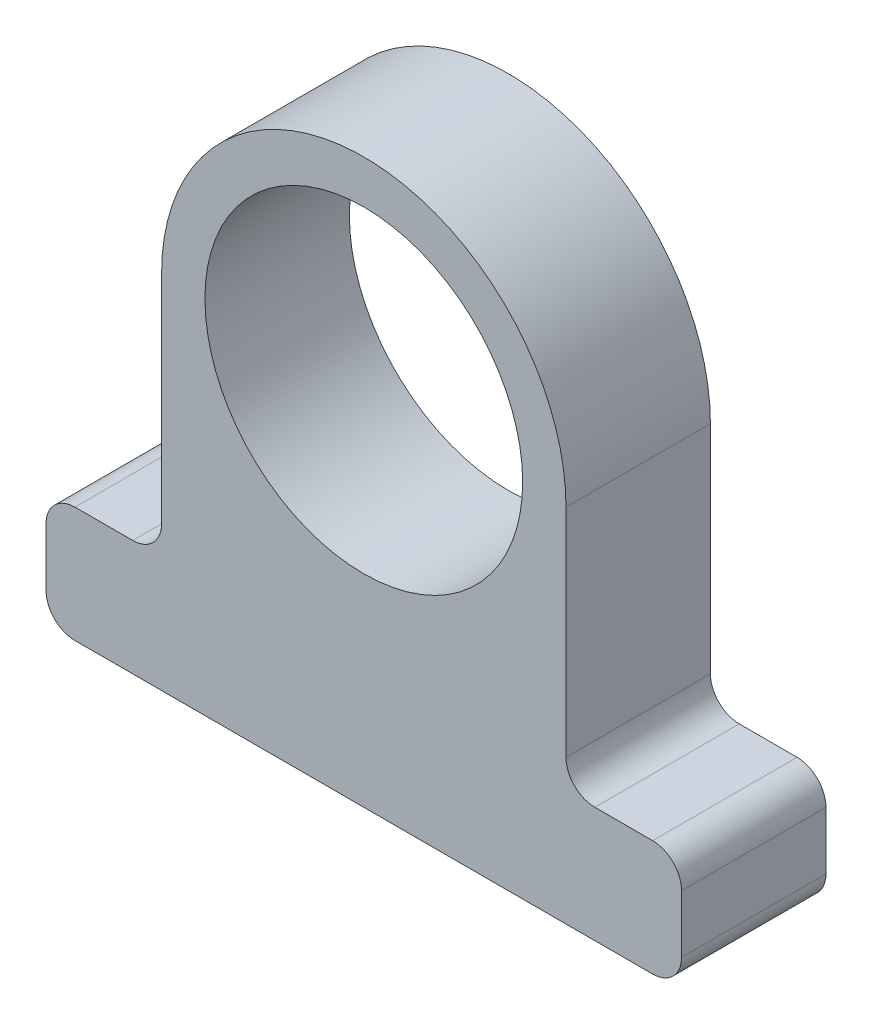
ISO-10303-21;
HEADER;
FILE_DESCRIPTION(('STEP AP214'),'2;1');
FILE_NAME('part.step','',(''),(''),'','','');
FILE_SCHEMA(('AUTOMOTIVE_DESIGN { 1 0 10303 214 1 1 1 1 }'));
ENDSEC;
DATA;
#1=APPLICATION_CONTEXT('core data for automotive mechanical design processes');
#2=APPLICATION_PROTOCOL_DEFINITION('international standard','automotive_design',2000,#1);
#3=PRODUCT_CONTEXT('',#1,'mechanical');
#4=PRODUCT('Part','Part','',(#3));
#5=PRODUCT_RELATED_PRODUCT_CATEGORY('part','',(#4));
#6=PRODUCT_DEFINITION_FORMATION('','',#4);
#7=PRODUCT_DEFINITION_CONTEXT('part definition',#1,'design');
#8=PRODUCT_DEFINITION('design','',#6,#7);
#9=PRODUCT_DEFINITION_SHAPE('','',#8);
#10=(LENGTH_UNIT() NAMED_UNIT(*) SI_UNIT(.MILLI.,.METRE.));
#11=(NAMED_UNIT(*) PLANE_ANGLE_UNIT() SI_UNIT($,.RADIAN.));
#12=(NAMED_UNIT(*) SI_UNIT($,.STERADIAN.) SOLID_ANGLE_UNIT());
#13=UNCERTAINTY_MEASURE_WITH_UNIT(LENGTH_MEASURE(1.E-05),#10,'distance_accuracy_value','');
#14=(GEOMETRIC_REPRESENTATION_CONTEXT(3) GLOBAL_UNCERTAINTY_ASSIGNED_CONTEXT((#13)) GLOBAL_UNIT_ASSIGNED_CONTEXT((#10,
#11,#12)) REPRESENTATION_CONTEXT('',''));
#15=CARTESIAN_POINT('',(0.,0.,0.));
#16=DIRECTION('',(0.,0.,1.));
#17=DIRECTION('',(1.,0.,0.));
#18=AXIS2_PLACEMENT_3D('',#15,#16,#17);
#19=CARTESIAN_POINT('',(14.,0.,10.));
#20=DIRECTION('',(-1.,0.,0.));
#21=DIRECTION('',(0.,-1.,0.));
#22=AXIS2_PLACEMENT_3D('',#19,#20,#21);
#23=PLANE('',#22);
#24=DIRECTION('',(0.,1.,0.));
#25=VECTOR('',#24,1.);
#26=CARTESIAN_POINT('',(14.,0.,10.));
#27=LINE('',#26,#25);
#28=CARTESIAN_POINT('',(14.,-15.,10.));
#29=VERTEX_POINT('',#28);
#30=CARTESIAN_POINT('',(14.,0.,10.));
#31=VERTEX_POINT('',#30);
#32=EDGE_CURVE('E146',#29,#31,#27,.T.);
#33=ORIENTED_EDGE('',*,*,#32,.F.);
#34=DIRECTION('',(0.,0.,-1.));
#35=VECTOR('',#34,1.);
#36=CARTESIAN_POINT('',(14.,-15.,0.));
#37=LINE('',#36,#35);
#38=CARTESIAN_POINT('',(14.,-15.,0.));
#39=VERTEX_POINT('',#38);
#40=EDGE_CURVE('E242',#29,#39,#37,.T.);
#41=ORIENTED_EDGE('',*,*,#40,.T.);
#42=DIRECTION('',(0.,1.,0.));
#43=VECTOR('',#42,1.);
#44=CARTESIAN_POINT('',(14.,0.,0.));
#45=LINE('',#44,#43);
#46=CARTESIAN_POINT('',(14.,0.,0.));
#47=VERTEX_POINT('',#46);
#48=EDGE_CURVE('E173',#39,#47,#45,.T.);
#49=ORIENTED_EDGE('',*,*,#48,.T.);
#50=DIRECTION('',(0.,0.,-1.));
#51=VECTOR('',#50,1.);
#52=CARTESIAN_POINT('',(14.,0.,10.));
#53=LINE('',#52,#51);
#54=EDGE_CURVE('E165',#31,#47,#53,.T.);
#55=ORIENTED_EDGE('',*,*,#54,.F.);
#56=EDGE_LOOP('',(#33,#41,#49,#55));
#57=FACE_BOUND('',#56,.T.);
#58=ADVANCED_FACE('F45',(#57),#23,.F.);
#59=CARTESIAN_POINT('',(0.,0.,10.));
#60=DIRECTION('',(0.,0.,-1.));
#61=DIRECTION('',(-1.,0.,0.));
#62=AXIS2_PLACEMENT_3D('',#59,#60,#61);
#63=CYLINDRICAL_SURFACE('',#62,14.);
#64=CARTESIAN_POINT('',(0.,0.,0.));
#65=DIRECTION('',(0.,0.,1.));
#66=DIRECTION('',(1.,0.,0.));
#67=AXIS2_PLACEMENT_3D('',#64,#65,#66);
#68=CIRCLE('',#67,14.);
#69=CARTESIAN_POINT('',(-14.,0.,0.));
#70=VERTEX_POINT('',#69);
#71=EDGE_CURVE('E323',#47,#70,#68,.T.);
#72=ORIENTED_EDGE('',*,*,#71,.T.);
#73=DIRECTION('',(0.,0.,-1.));
#74=VECTOR('',#73,1.);
#75=CARTESIAN_POINT('',(-14.,0.,10.));
#76=LINE('',#75,#74);
#77=CARTESIAN_POINT('',(-14.,0.,10.));
#78=VERTEX_POINT('',#77);
#79=EDGE_CURVE('E167',#78,#70,#76,.T.);
#80=ORIENTED_EDGE('',*,*,#79,.F.);
#81=CARTESIAN_POINT('',(0.,0.,10.));
#82=DIRECTION('',(0.,0.,1.));
#83=DIRECTION('',(1.,0.,0.));
#84=AXIS2_PLACEMENT_3D('',#81,#82,#83);
#85=CIRCLE('',#84,14.);
#86=EDGE_CURVE('E152',#31,#78,#85,.T.);
#87=ORIENTED_EDGE('',*,*,#86,.F.);
#88=ORIENTED_EDGE('',*,*,#54,.T.);
#89=EDGE_LOOP('',(#72,#80,#87,#88));
#90=FACE_BOUND('',#89,.T.);
#91=ADVANCED_FACE('F164',(#90),#63,.T.);
#92=CARTESIAN_POINT('',(-14.,0.,10.));
#93=DIRECTION('',(1.,0.,0.));
#94=DIRECTION('',(0.,1.,0.));
#95=AXIS2_PLACEMENT_3D('',#92,#93,#94);
#96=PLANE('',#95);
#97=DIRECTION('',(0.,-1.,0.));
#98=VECTOR('',#97,1.);
#99=CARTESIAN_POINT('',(-14.,0.,0.));
#100=LINE('',#99,#98);
#101=CARTESIAN_POINT('',(-14.,-15.,0.));
#102=VERTEX_POINT('',#101);
#103=EDGE_CURVE('E326',#70,#102,#100,.T.);
#104=ORIENTED_EDGE('',*,*,#103,.T.);
#105=DIRECTION('',(0.,0.,-1.));
#106=VECTOR('',#105,1.);
#107=CARTESIAN_POINT('',(-14.,-15.,10.));
#108=LINE('',#107,#106);
#109=CARTESIAN_POINT('',(-14.,-15.,10.));
#110=VERTEX_POINT('',#109);
#111=EDGE_CURVE('E226',#102,#110,#108,.F.);
#112=ORIENTED_EDGE('',*,*,#111,.T.);
#113=DIRECTION('',(0.,-1.,0.));
#114=VECTOR('',#113,1.);
#115=CARTESIAN_POINT('',(-14.,0.,10.));
#116=LINE('',#115,#114);
#117=EDGE_CURVE('E170',#78,#110,#116,.T.);
#118=ORIENTED_EDGE('',*,*,#117,.F.);
#119=ORIENTED_EDGE('',*,*,#79,.T.);
#120=EDGE_LOOP('',(#104,#112,#118,#119));
#121=FACE_BOUND('',#120,.T.);
#122=ADVANCED_FACE('F275',(#121),#96,.F.);
#123=CARTESIAN_POINT('',(0.,-17.,10.));
#124=DIRECTION('',(0.,-1.,0.));
#125=DIRECTION('',(0.,0.,-1.));
#126=AXIS2_PLACEMENT_3D('',#123,#124,#125);
#127=PLANE('',#126);
#128=DIRECTION('',(-1.,0.,0.));
#129=VECTOR('',#128,1.);
#130=CARTESIAN_POINT('',(0.,-17.,10.));
#131=LINE('',#130,#129);
#132=CARTESIAN_POINT('',(-16.,-17.,10.));
#133=VERTEX_POINT('',#132);
#134=CARTESIAN_POINT('',(-20.,-17.,10.));
#135=VERTEX_POINT('',#134);
#136=EDGE_CURVE('E382',#133,#135,#131,.T.);
#137=ORIENTED_EDGE('',*,*,#136,.F.);
#138=DIRECTION('',(0.,0.,-1.));
#139=VECTOR('',#138,1.);
#140=CARTESIAN_POINT('',(-16.,-17.,0.));
#141=LINE('',#140,#139);
#142=CARTESIAN_POINT('',(-16.,-17.,0.));
#143=VERTEX_POINT('',#142);
#144=EDGE_CURVE('E222',#133,#143,#141,.T.);
#145=ORIENTED_EDGE('',*,*,#144,.T.);
#146=DIRECTION('',(-1.,0.,0.));
#147=VECTOR('',#146,1.);
#148=CARTESIAN_POINT('',(0.,-17.,0.));
#149=LINE('',#148,#147);
#150=CARTESIAN_POINT('',(-20.,-17.,0.));
#151=VERTEX_POINT('',#150);
#152=EDGE_CURVE('E330',#143,#151,#149,.T.);
#153=ORIENTED_EDGE('',*,*,#152,.T.);
#154=DIRECTION('',(0.,0.,-1.));
#155=VECTOR('',#154,1.);
#156=CARTESIAN_POINT('',(-20.,-17.,10.));
#157=LINE('',#156,#155);
#158=EDGE_CURVE('E219',#151,#135,#157,.F.);
#159=ORIENTED_EDGE('',*,*,#158,.T.);
#160=EDGE_LOOP('',(#137,#145,#153,#159));
#161=FACE_BOUND('',#160,.T.);
#162=ADVANCED_FACE('F368',(#161),#127,.F.);
#163=CARTESIAN_POINT('',(-22.,0.,10.));
#164=DIRECTION('',(1.,0.,0.));
#165=DIRECTION('',(0.,0.,-1.));
#166=AXIS2_PLACEMENT_3D('',#163,#164,#165);
#167=PLANE('',#166);
#168=DIRECTION('',(0.,-1.,0.));
#169=VECTOR('',#168,1.);
#170=CARTESIAN_POINT('',(-22.,0.,0.));
#171=LINE('',#170,#169);
#172=CARTESIAN_POINT('',(-22.,-19.,0.));
#173=VERTEX_POINT('',#172);
#174=CARTESIAN_POINT('',(-22.,-23.,0.));
#175=VERTEX_POINT('',#174);
#176=EDGE_CURVE('E334',#173,#175,#171,.T.);
#177=ORIENTED_EDGE('',*,*,#176,.T.);
#178=DIRECTION('',(0.,0.,-1.));
#179=VECTOR('',#178,1.);
#180=CARTESIAN_POINT('',(-22.,-23.,10.));
#181=LINE('',#180,#179);
#182=CARTESIAN_POINT('',(-22.,-23.,10.));
#183=VERTEX_POINT('',#182);
#184=EDGE_CURVE('E205',#175,#183,#181,.F.);
#185=ORIENTED_EDGE('',*,*,#184,.T.);
#186=DIRECTION('',(0.,-1.,0.));
#187=VECTOR('',#186,1.);
#188=CARTESIAN_POINT('',(-22.,0.,10.));
#189=LINE('',#188,#187);
#190=CARTESIAN_POINT('',(-22.,-19.,10.));
#191=VERTEX_POINT('',#190);
#192=EDGE_CURVE('E314',#191,#183,#189,.T.);
#193=ORIENTED_EDGE('',*,*,#192,.F.);
#194=DIRECTION('',(0.,0.,-1.));
#195=VECTOR('',#194,1.);
#196=CARTESIAN_POINT('',(-22.,-19.,10.));
#197=LINE('',#196,#195);
#198=EDGE_CURVE('E201',#191,#173,#197,.T.);
#199=ORIENTED_EDGE('',*,*,#198,.T.);
#200=EDGE_LOOP('',(#177,#185,#193,#199));
#201=FACE_BOUND('',#200,.T.);
#202=ADVANCED_FACE('F364',(#201),#167,.F.);
#203=CARTESIAN_POINT('',(0.,-25.,10.));
#204=DIRECTION('',(0.,1.,0.));
#205=DIRECTION('',(0.,0.,1.));
#206=AXIS2_PLACEMENT_3D('',#203,#204,#205);
#207=PLANE('',#206);
#208=DIRECTION('',(1.,0.,0.));
#209=VECTOR('',#208,1.);
#210=CARTESIAN_POINT('',(0.,-25.,10.));
#211=LINE('',#210,#209);
#212=CARTESIAN_POINT('',(-20.,-25.,10.));
#213=VERTEX_POINT('',#212);
#214=CARTESIAN_POINT('',(20.,-25.,10.));
#215=VERTEX_POINT('',#214);
#216=EDGE_CURVE('E302',#213,#215,#211,.T.);
#217=ORIENTED_EDGE('',*,*,#216,.F.);
#218=DIRECTION('',(0.,0.,-1.));
#219=VECTOR('',#218,1.);
#220=CARTESIAN_POINT('',(-20.,-25.,10.));
#221=LINE('',#220,#219);
#222=CARTESIAN_POINT('',(-20.,-25.,0.));
#223=VERTEX_POINT('',#222);
#224=EDGE_CURVE('E180',#213,#223,#221,.T.);
#225=ORIENTED_EDGE('',*,*,#224,.T.);
#226=DIRECTION('',(1.,0.,0.));
#227=VECTOR('',#226,1.);
#228=CARTESIAN_POINT('',(0.,-25.,0.));
#229=LINE('',#228,#227);
#230=CARTESIAN_POINT('',(20.,-25.,0.));
#231=VERTEX_POINT('',#230);
#232=EDGE_CURVE('E338',#223,#231,#229,.T.);
#233=ORIENTED_EDGE('',*,*,#232,.T.);
#234=DIRECTION('',(0.,0.,-1.));
#235=VECTOR('',#234,1.);
#236=CARTESIAN_POINT('',(20.,-25.,10.));
#237=LINE('',#236,#235);
#238=EDGE_CURVE('E176',#231,#215,#237,.F.);
#239=ORIENTED_EDGE('',*,*,#238,.T.);
#240=EDGE_LOOP('',(#217,#225,#233,#239));
#241=FACE_BOUND('',#240,.T.);
#242=ADVANCED_FACE('F361',(#241),#207,.F.);
#243=CARTESIAN_POINT('',(22.,0.,10.));
#244=DIRECTION('',(-1.,0.,0.));
#245=DIRECTION('',(0.,0.,1.));
#246=AXIS2_PLACEMENT_3D('',#243,#244,#245);
#247=PLANE('',#246);
#248=DIRECTION('',(0.,1.,0.));
#249=VECTOR('',#248,1.);
#250=CARTESIAN_POINT('',(22.,0.,10.));
#251=LINE('',#250,#249);
#252=CARTESIAN_POINT('',(22.,-23.,10.));
#253=VERTEX_POINT('',#252);
#254=CARTESIAN_POINT('',(22.,-19.,10.));
#255=VERTEX_POINT('',#254);
#256=EDGE_CURVE('E300',#253,#255,#251,.T.);
#257=ORIENTED_EDGE('',*,*,#256,.F.);
#258=DIRECTION('',(0.,0.,-1.));
#259=VECTOR('',#258,1.);
#260=CARTESIAN_POINT('',(22.,-23.,10.));
#261=LINE('',#260,#259);
#262=CARTESIAN_POINT('',(22.,-23.,0.));
#263=VERTEX_POINT('',#262);
#264=EDGE_CURVE('E232',#253,#263,#261,.T.);
#265=ORIENTED_EDGE('',*,*,#264,.T.);
#266=DIRECTION('',(0.,1.,0.));
#267=VECTOR('',#266,1.);
#268=CARTESIAN_POINT('',(22.,0.,0.));
#269=LINE('',#268,#267);
#270=CARTESIAN_POINT('',(22.,-19.,0.));
#271=VERTEX_POINT('',#270);
#272=EDGE_CURVE('E261',#263,#271,#269,.T.);
#273=ORIENTED_EDGE('',*,*,#272,.T.);
#274=DIRECTION('',(0.,0.,-1.));
#275=VECTOR('',#274,1.);
#276=CARTESIAN_POINT('',(22.,-19.,10.));
#277=LINE('',#276,#275);
#278=EDGE_CURVE('E229',#271,#255,#277,.F.);
#279=ORIENTED_EDGE('',*,*,#278,.T.);
#280=EDGE_LOOP('',(#257,#265,#273,#279));
#281=FACE_BOUND('',#280,.T.);
#282=ADVANCED_FACE('F304',(#281),#247,.F.);
#283=CARTESIAN_POINT('',(0.,-17.,10.));
#284=DIRECTION('',(0.,-1.,0.));
#285=DIRECTION('',(0.,0.,-1.));
#286=AXIS2_PLACEMENT_3D('',#283,#284,#285);
#287=PLANE('',#286);
#288=DIRECTION('',(-1.,0.,0.));
#289=VECTOR('',#288,1.);
#290=CARTESIAN_POINT('',(0.,-17.,10.));
#291=LINE('',#290,#289);
#292=CARTESIAN_POINT('',(20.,-17.,10.));
#293=VERTEX_POINT('',#292);
#294=CARTESIAN_POINT('',(16.,-17.,10.));
#295=VERTEX_POINT('',#294);
#296=EDGE_CURVE('E309',#293,#295,#291,.T.);
#297=ORIENTED_EDGE('',*,*,#296,.F.);
#298=DIRECTION('',(0.,0.,-1.));
#299=VECTOR('',#298,1.);
#300=CARTESIAN_POINT('',(20.,-17.,10.));
#301=LINE('',#300,#299);
#302=CARTESIAN_POINT('',(20.,-17.,0.));
#303=VERTEX_POINT('',#302);
#304=EDGE_CURVE('E238',#293,#303,#301,.T.);
#305=ORIENTED_EDGE('',*,*,#304,.T.);
#306=DIRECTION('',(-1.,0.,0.));
#307=VECTOR('',#306,1.);
#308=CARTESIAN_POINT('',(0.,-17.,0.));
#309=LINE('',#308,#307);
#310=CARTESIAN_POINT('',(16.,-17.,0.));
#311=VERTEX_POINT('',#310);
#312=EDGE_CURVE('E256',#303,#311,#309,.T.);
#313=ORIENTED_EDGE('',*,*,#312,.T.);
#314=DIRECTION('',(0.,0.,-1.));
#315=VECTOR('',#314,1.);
#316=CARTESIAN_POINT('',(16.,-17.,10.));
#317=LINE('',#316,#315);
#318=EDGE_CURVE('E61',#311,#295,#317,.F.);
#319=ORIENTED_EDGE('',*,*,#318,.T.);
#320=EDGE_LOOP('',(#297,#305,#313,#319));
#321=FACE_BOUND('',#320,.T.);
#322=ADVANCED_FACE('F258',(#321),#287,.F.);
#323=CARTESIAN_POINT('',(0.,0.,10.));
#324=DIRECTION('',(0.,0.,-1.));
#325=DIRECTION('',(-1.,0.,0.));
#326=AXIS2_PLACEMENT_3D('',#323,#324,#325);
#327=CYLINDRICAL_SURFACE('',#326,11.);
#328=CARTESIAN_POINT('',(0.,0.,10.));
#329=DIRECTION('',(0.,0.,1.));
#330=DIRECTION('',(1.,0.,0.));
#331=AXIS2_PLACEMENT_3D('',#328,#329,#330);
#332=CIRCLE('',#331,11.);
#333=CARTESIAN_POINT('',(11.,0.,10.));
#334=VERTEX_POINT('',#333);
#335=EDGE_CURVE('E182',#334,#334,#332,.T.);
#336=ORIENTED_EDGE('',*,*,#335,.T.);
#337=EDGE_LOOP('',(#336));
#338=FACE_BOUND('',#337,.T.);
#339=CARTESIAN_POINT('',(0.,0.,0.));
#340=DIRECTION('',(0.,0.,1.));
#341=DIRECTION('',(1.,0.,0.));
#342=AXIS2_PLACEMENT_3D('',#339,#340,#341);
#343=CIRCLE('',#342,11.);
#344=CARTESIAN_POINT('',(11.,0.,0.));
#345=VERTEX_POINT('',#344);
#346=EDGE_CURVE('E160',#345,#345,#343,.T.);
#347=ORIENTED_EDGE('',*,*,#346,.F.);
#348=EDGE_LOOP('',(#347));
#349=FACE_BOUND('',#348,.T.);
#350=ADVANCED_FACE('F347',(#338,#349),#327,.F.);
#351=CARTESIAN_POINT('',(0.,0.,10.));
#352=DIRECTION('',(0.,0.,1.));
#353=DIRECTION('',(1.,0.,0.));
#354=AXIS2_PLACEMENT_3D('',#351,#352,#353);
#355=PLANE('',#354);
#356=ORIENTED_EDGE('',*,*,#192,.T.);
#357=CARTESIAN_POINT('',(-20.,-23.,10.));
#358=DIRECTION('',(0.,0.,1.));
#359=DIRECTION('',(1.,0.,0.));
#360=AXIS2_PLACEMENT_3D('',#357,#358,#359);
#361=CIRCLE('',#360,2.);
#362=EDGE_CURVE('E216',#183,#213,#361,.T.);
#363=ORIENTED_EDGE('',*,*,#362,.T.);
#364=ORIENTED_EDGE('',*,*,#216,.T.);
#365=CARTESIAN_POINT('',(20.,-23.,10.));
#366=DIRECTION('',(0.,0.,1.));
#367=DIRECTION('',(1.,0.,0.));
#368=AXIS2_PLACEMENT_3D('',#365,#366,#367);
#369=CIRCLE('',#368,2.);
#370=EDGE_CURVE('E210',#215,#253,#369,.T.);
#371=ORIENTED_EDGE('',*,*,#370,.T.);
#372=ORIENTED_EDGE('',*,*,#256,.T.);
#373=CARTESIAN_POINT('',(20.,-19.,10.));
#374=DIRECTION('',(0.,0.,1.));
#375=DIRECTION('',(1.,0.,0.));
#376=AXIS2_PLACEMENT_3D('',#373,#374,#375);
#377=CIRCLE('',#376,2.);
#378=EDGE_CURVE('E68',#255,#293,#377,.T.);
#379=ORIENTED_EDGE('',*,*,#378,.T.);
#380=ORIENTED_EDGE('',*,*,#296,.T.);
#381=CARTESIAN_POINT('',(16.,-15.,10.));
#382=DIRECTION('',(0.,0.,1.));
#383=DIRECTION('',(1.,0.,0.));
#384=AXIS2_PLACEMENT_3D('',#381,#382,#383);
#385=CIRCLE('',#384,2.);
#386=EDGE_CURVE('E11',#295,#29,#385,.F.);
#387=ORIENTED_EDGE('',*,*,#386,.T.);
#388=ORIENTED_EDGE('',*,*,#32,.T.);
#389=ORIENTED_EDGE('',*,*,#86,.T.);
#390=ORIENTED_EDGE('',*,*,#117,.T.);
#391=CARTESIAN_POINT('',(-16.,-15.,10.));
#392=DIRECTION('',(0.,0.,1.));
#393=DIRECTION('',(1.,0.,0.));
#394=AXIS2_PLACEMENT_3D('',#391,#392,#393);
#395=CIRCLE('',#394,2.);
#396=EDGE_CURVE('E248',#110,#133,#395,.F.);
#397=ORIENTED_EDGE('',*,*,#396,.T.);
#398=ORIENTED_EDGE('',*,*,#136,.T.);
#399=CARTESIAN_POINT('',(-20.,-19.,10.));
#400=DIRECTION('',(0.,0.,1.));
#401=DIRECTION('',(1.,0.,0.));
#402=AXIS2_PLACEMENT_3D('',#399,#400,#401);
#403=CIRCLE('',#402,2.);
#404=EDGE_CURVE('E213',#135,#191,#403,.T.);
#405=ORIENTED_EDGE('',*,*,#404,.T.);
#406=EDGE_LOOP('',(#356,#363,#364,#371,#372,#379,#380,#387,#388,#389,#390,#397,#398,#405));
#407=FACE_BOUND('',#406,.T.);
#408=ORIENTED_EDGE('',*,*,#335,.F.);
#409=EDGE_LOOP('',(#408));
#410=FACE_BOUND('',#409,.T.);
#411=ADVANCED_FACE('F149',(#407,#410),#355,.T.);
#412=CARTESIAN_POINT('',(0.,0.,0.));
#413=DIRECTION('',(0.,0.,1.));
#414=DIRECTION('',(1.,0.,0.));
#415=AXIS2_PLACEMENT_3D('',#412,#413,#414);
#416=PLANE('',#415);
#417=ORIENTED_EDGE('',*,*,#232,.F.);
#418=CARTESIAN_POINT('',(-20.,-23.,0.));
#419=DIRECTION('',(0.,0.,1.));
#420=DIRECTION('',(1.,0.,0.));
#421=AXIS2_PLACEMENT_3D('',#418,#419,#420);
#422=CIRCLE('',#421,2.);
#423=EDGE_CURVE('E198',#223,#175,#422,.F.);
#424=ORIENTED_EDGE('',*,*,#423,.T.);
#425=ORIENTED_EDGE('',*,*,#176,.F.);
#426=CARTESIAN_POINT('',(-20.,-19.,0.));
#427=DIRECTION('',(0.,0.,1.));
#428=DIRECTION('',(1.,0.,0.));
#429=AXIS2_PLACEMENT_3D('',#426,#427,#428);
#430=CIRCLE('',#429,2.);
#431=EDGE_CURVE('E195',#173,#151,#430,.F.);
#432=ORIENTED_EDGE('',*,*,#431,.T.);
#433=ORIENTED_EDGE('',*,*,#152,.F.);
#434=CARTESIAN_POINT('',(-16.,-15.,0.));
#435=DIRECTION('',(0.,0.,1.));
#436=DIRECTION('',(1.,0.,0.));
#437=AXIS2_PLACEMENT_3D('',#434,#435,#436);
#438=CIRCLE('',#437,2.);
#439=EDGE_CURVE('E245',#143,#102,#438,.T.);
#440=ORIENTED_EDGE('',*,*,#439,.T.);
#441=ORIENTED_EDGE('',*,*,#103,.F.);
#442=ORIENTED_EDGE('',*,*,#71,.F.);
#443=ORIENTED_EDGE('',*,*,#48,.F.);
#444=CARTESIAN_POINT('',(16.,-15.,0.));
#445=DIRECTION('',(0.,0.,1.));
#446=DIRECTION('',(1.,0.,0.));
#447=AXIS2_PLACEMENT_3D('',#444,#445,#446);
#448=CIRCLE('',#447,2.);
#449=EDGE_CURVE('E54',#39,#311,#448,.T.);
#450=ORIENTED_EDGE('',*,*,#449,.T.);
#451=ORIENTED_EDGE('',*,*,#312,.F.);
#452=CARTESIAN_POINT('',(20.,-19.,0.));
#453=DIRECTION('',(0.,0.,1.));
#454=DIRECTION('',(1.,0.,0.));
#455=AXIS2_PLACEMENT_3D('',#452,#453,#454);
#456=CIRCLE('',#455,2.);
#457=EDGE_CURVE('E189',#303,#271,#456,.F.);
#458=ORIENTED_EDGE('',*,*,#457,.T.);
#459=ORIENTED_EDGE('',*,*,#272,.F.);
#460=CARTESIAN_POINT('',(20.,-23.,0.));
#461=DIRECTION('',(0.,0.,1.));
#462=DIRECTION('',(1.,0.,0.));
#463=AXIS2_PLACEMENT_3D('',#460,#461,#462);
#464=CIRCLE('',#463,2.);
#465=EDGE_CURVE('E192',#263,#231,#464,.F.);
#466=ORIENTED_EDGE('',*,*,#465,.T.);
#467=EDGE_LOOP('',(#417,#424,#425,#432,#433,#440,#441,#442,#443,#450,#451,#458,#459,#466));
#468=FACE_BOUND('',#467,.T.);
#469=ORIENTED_EDGE('',*,*,#346,.T.);
#470=EDGE_LOOP('',(#469));
#471=FACE_BOUND('',#470,.T.);
#472=ADVANCED_FACE('F254',(#468,#471),#416,.F.);
#473=CARTESIAN_POINT('',(-20.,-23.,10.));
#474=DIRECTION('',(0.,0.,-1.));
#475=DIRECTION('',(-1.,0.,0.));
#476=AXIS2_PLACEMENT_3D('',#473,#474,#475);
#477=CYLINDRICAL_SURFACE('',#476,2.);
#478=ORIENTED_EDGE('',*,*,#362,.F.);
#479=ORIENTED_EDGE('',*,*,#184,.F.);
#480=ORIENTED_EDGE('',*,*,#423,.F.);
#481=ORIENTED_EDGE('',*,*,#224,.F.);
#482=EDGE_LOOP('',(#478,#479,#480,#481));
#483=FACE_BOUND('',#482,.T.);
#484=ADVANCED_FACE('F279',(#483),#477,.T.);
#485=CARTESIAN_POINT('',(-16.,-15.,10.));
#486=DIRECTION('',(0.,0.,1.));
#487=DIRECTION('',(1.,0.,0.));
#488=AXIS2_PLACEMENT_3D('',#485,#486,#487);
#489=CYLINDRICAL_SURFACE('',#488,2.);
#490=ORIENTED_EDGE('',*,*,#396,.F.);
#491=ORIENTED_EDGE('',*,*,#111,.F.);
#492=ORIENTED_EDGE('',*,*,#439,.F.);
#493=ORIENTED_EDGE('',*,*,#144,.F.);
#494=EDGE_LOOP('',(#490,#491,#492,#493));
#495=FACE_BOUND('',#494,.T.);
#496=ADVANCED_FACE('F282',(#495),#489,.F.);
#497=CARTESIAN_POINT('',(-20.,-19.,10.));
#498=DIRECTION('',(0.,0.,-1.));
#499=DIRECTION('',(-1.,0.,0.));
#500=AXIS2_PLACEMENT_3D('',#497,#498,#499);
#501=CYLINDRICAL_SURFACE('',#500,2.);
#502=ORIENTED_EDGE('',*,*,#404,.F.);
#503=ORIENTED_EDGE('',*,*,#158,.F.);
#504=ORIENTED_EDGE('',*,*,#431,.F.);
#505=ORIENTED_EDGE('',*,*,#198,.F.);
#506=EDGE_LOOP('',(#502,#503,#504,#505));
#507=FACE_BOUND('',#506,.T.);
#508=ADVANCED_FACE('F286',(#507),#501,.T.);
#509=CARTESIAN_POINT('',(20.,-23.,10.));
#510=DIRECTION('',(0.,0.,-1.));
#511=DIRECTION('',(-1.,0.,0.));
#512=AXIS2_PLACEMENT_3D('',#509,#510,#511);
#513=CYLINDRICAL_SURFACE('',#512,2.);
#514=ORIENTED_EDGE('',*,*,#370,.F.);
#515=ORIENTED_EDGE('',*,*,#238,.F.);
#516=ORIENTED_EDGE('',*,*,#465,.F.);
#517=ORIENTED_EDGE('',*,*,#264,.F.);
#518=EDGE_LOOP('',(#514,#515,#516,#517));
#519=FACE_BOUND('',#518,.T.);
#520=ADVANCED_FACE('F268',(#519),#513,.T.);
#521=CARTESIAN_POINT('',(20.,-19.,10.));
#522=DIRECTION('',(0.,0.,-1.));
#523=DIRECTION('',(-1.,0.,0.));
#524=AXIS2_PLACEMENT_3D('',#521,#522,#523);
#525=CYLINDRICAL_SURFACE('',#524,2.);
#526=ORIENTED_EDGE('',*,*,#378,.F.);
#527=ORIENTED_EDGE('',*,*,#278,.F.);
#528=ORIENTED_EDGE('',*,*,#457,.F.);
#529=ORIENTED_EDGE('',*,*,#304,.F.);
#530=EDGE_LOOP('',(#526,#527,#528,#529));
#531=FACE_BOUND('',#530,.T.);
#532=ADVANCED_FACE('F264',(#531),#525,.T.);
#533=CARTESIAN_POINT('',(16.,-15.,10.));
#534=DIRECTION('',(0.,0.,1.));
#535=DIRECTION('',(1.,0.,0.));
#536=AXIS2_PLACEMENT_3D('',#533,#534,#535);
#537=CYLINDRICAL_SURFACE('',#536,2.);
#538=ORIENTED_EDGE('',*,*,#386,.F.);
#539=ORIENTED_EDGE('',*,*,#318,.F.);
#540=ORIENTED_EDGE('',*,*,#449,.F.);
#541=ORIENTED_EDGE('',*,*,#40,.F.);
#542=EDGE_LOOP('',(#538,#539,#540,#541));
#543=FACE_BOUND('',#542,.T.);
#544=ADVANCED_FACE('F47',(#543),#537,.F.);
#545=CLOSED_SHELL('',(#58,#91,#122,#162,#202,#242,#282,#322,#350,#411,#472,#484,#496,#508,#520,
#532,#544));
#546=MANIFOLD_SOLID_BREP('B2',#545);
#547=ADVANCED_BREP_SHAPE_REPRESENTATION('',(#18,#546),#14);
#548=SHAPE_DEFINITION_REPRESENTATION(#9,#547);
ENDSEC;
END-ISO-10303-21;
